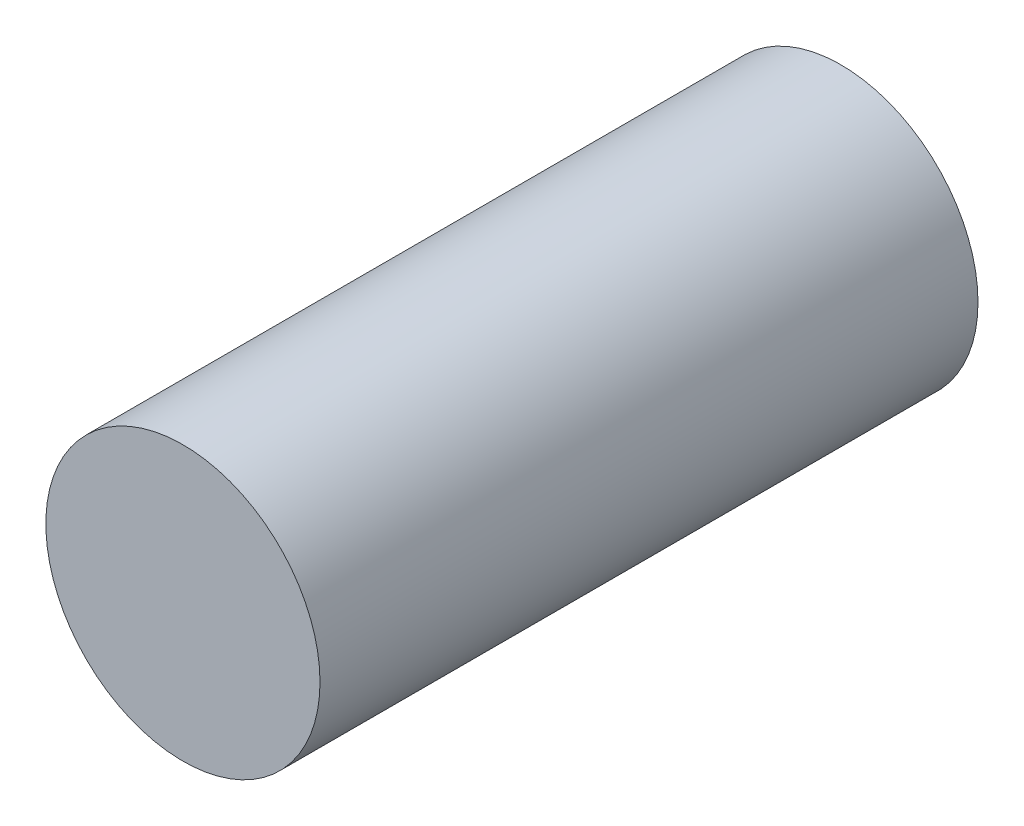
ISO-10303-21;
HEADER;
FILE_DESCRIPTION(('STEP AP214'),'2;1');
FILE_NAME('part.step','',(''),(''),'','','');
FILE_SCHEMA(('AUTOMOTIVE_DESIGN { 1 0 10303 214 1 1 1 1 }'));
ENDSEC;
DATA;
#1=APPLICATION_CONTEXT('core data for automotive mechanical design processes');
#2=APPLICATION_PROTOCOL_DEFINITION('international standard','automotive_design',2000,#1);
#3=PRODUCT_CONTEXT('',#1,'mechanical');
#4=PRODUCT('Part','Part','',(#3));
#5=PRODUCT_RELATED_PRODUCT_CATEGORY('part','',(#4));
#6=PRODUCT_DEFINITION_FORMATION('','',#4);
#7=PRODUCT_DEFINITION_CONTEXT('part definition',#1,'design');
#8=PRODUCT_DEFINITION('design','',#6,#7);
#9=PRODUCT_DEFINITION_SHAPE('','',#8);
#10=(LENGTH_UNIT() NAMED_UNIT(*) SI_UNIT(.MILLI.,.METRE.));
#11=(NAMED_UNIT(*) PLANE_ANGLE_UNIT() SI_UNIT($,.RADIAN.));
#12=(NAMED_UNIT(*) SI_UNIT($,.STERADIAN.) SOLID_ANGLE_UNIT());
#13=UNCERTAINTY_MEASURE_WITH_UNIT(LENGTH_MEASURE(1.E-05),#10,'distance_accuracy_value','');
#14=(GEOMETRIC_REPRESENTATION_CONTEXT(3) GLOBAL_UNCERTAINTY_ASSIGNED_CONTEXT((#13)) GLOBAL_UNIT_ASSIGNED_CONTEXT((#10,
#11,#12)) REPRESENTATION_CONTEXT('',''));
#15=CARTESIAN_POINT('',(0.,0.,0.));
#16=DIRECTION('',(0.,0.,1.));
#17=DIRECTION('',(1.,0.,0.));
#18=AXIS2_PLACEMENT_3D('',#15,#16,#17);
#19=CARTESIAN_POINT('',(0.,0.,15.));
#20=DIRECTION('',(0.,0.,-1.));
#21=DIRECTION('',(-1.,0.,0.));
#22=AXIS2_PLACEMENT_3D('',#19,#20,#21);
#23=CYLINDRICAL_SURFACE('',#22,6.25);
#24=CARTESIAN_POINT('',(0.,0.,15.));
#25=DIRECTION('',(0.,0.,1.));
#26=DIRECTION('',(1.,0.,0.));
#27=AXIS2_PLACEMENT_3D('',#24,#25,#26);
#28=CIRCLE('',#27,6.25);
#29=CARTESIAN_POINT('',(6.25,0.,15.));
#30=VERTEX_POINT('',#29);
#31=EDGE_CURVE('E10',#30,#30,#28,.T.);
#32=ORIENTED_EDGE('',*,*,#31,.F.);
#33=EDGE_LOOP('',(#32));
#34=FACE_BOUND('',#33,.T.);
#35=CARTESIAN_POINT('',(0.,0.,-15.));
#36=DIRECTION('',(0.,0.,1.));
#37=DIRECTION('',(1.,0.,0.));
#38=AXIS2_PLACEMENT_3D('',#35,#36,#37);
#39=CIRCLE('',#38,6.25);
#40=CARTESIAN_POINT('',(6.25,0.,-15.));
#41=VERTEX_POINT('',#40);
#42=EDGE_CURVE('E36',#41,#41,#39,.T.);
#43=ORIENTED_EDGE('',*,*,#42,.T.);
#44=EDGE_LOOP('',(#43));
#45=FACE_BOUND('',#44,.T.);
#46=ADVANCED_FACE('F33',(#34,#45),#23,.T.);
#47=CARTESIAN_POINT('',(0.,0.,15.));
#48=DIRECTION('',(0.,0.,1.));
#49=DIRECTION('',(1.,0.,0.));
#50=AXIS2_PLACEMENT_3D('',#47,#48,#49);
#51=PLANE('',#50);
#52=ORIENTED_EDGE('',*,*,#31,.T.);
#53=EDGE_LOOP('',(#52));
#54=FACE_BOUND('',#53,.T.);
#55=ADVANCED_FACE('F48',(#54),#51,.T.);
#56=CARTESIAN_POINT('',(0.,0.,-15.));
#57=DIRECTION('',(0.,0.,1.));
#58=DIRECTION('',(1.,0.,0.));
#59=AXIS2_PLACEMENT_3D('',#56,#57,#58);
#60=PLANE('',#59);
#61=ORIENTED_EDGE('',*,*,#42,.F.);
#62=EDGE_LOOP('',(#61));
#63=FACE_BOUND('',#62,.T.);
#64=ADVANCED_FACE('F46',(#63),#60,.F.);
#65=CLOSED_SHELL('',(#46,#55,#64));
#66=MANIFOLD_SOLID_BREP('B2',#65);
#67=ADVANCED_BREP_SHAPE_REPRESENTATION('',(#18,#66),#14);
#68=SHAPE_DEFINITION_REPRESENTATION(#9,#67);
ENDSEC;
END-ISO-10303-21;
